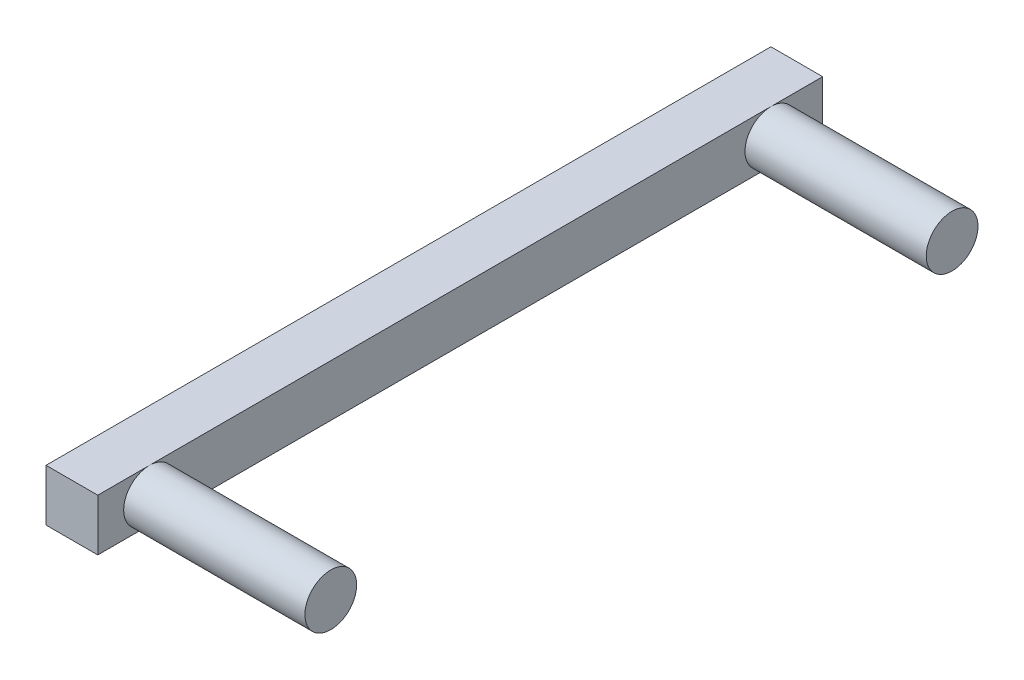
ISO-10303-21;
HEADER;
FILE_DESCRIPTION(('STEP AP214'),'2;1');
FILE_NAME('part.step','',(''),(''),'','','');
FILE_SCHEMA(('AUTOMOTIVE_DESIGN { 1 0 10303 214 1 1 1 1 }'));
ENDSEC;
DATA;
#1=APPLICATION_CONTEXT('core data for automotive mechanical design processes');
#2=APPLICATION_PROTOCOL_DEFINITION('international standard','automotive_design',2000,#1);
#3=PRODUCT_CONTEXT('',#1,'mechanical');
#4=PRODUCT('Part','Part','',(#3));
#5=PRODUCT_RELATED_PRODUCT_CATEGORY('part','',(#4));
#6=PRODUCT_DEFINITION_FORMATION('','',#4);
#7=PRODUCT_DEFINITION_CONTEXT('part definition',#1,'design');
#8=PRODUCT_DEFINITION('design','',#6,#7);
#9=PRODUCT_DEFINITION_SHAPE('','',#8);
#10=(LENGTH_UNIT() NAMED_UNIT(*) SI_UNIT(.MILLI.,.METRE.));
#11=(NAMED_UNIT(*) PLANE_ANGLE_UNIT() SI_UNIT($,.RADIAN.));
#12=(NAMED_UNIT(*) SI_UNIT($,.STERADIAN.) SOLID_ANGLE_UNIT());
#13=UNCERTAINTY_MEASURE_WITH_UNIT(LENGTH_MEASURE(1.E-05),#10,'distance_accuracy_value','');
#14=(GEOMETRIC_REPRESENTATION_CONTEXT(3) GLOBAL_UNCERTAINTY_ASSIGNED_CONTEXT((#13)) GLOBAL_UNIT_ASSIGNED_CONTEXT((#10,
#11,#12)) REPRESENTATION_CONTEXT('',''));
#15=CARTESIAN_POINT('',(0.,0.,0.));
#16=DIRECTION('',(0.,0.,1.));
#17=DIRECTION('',(1.,0.,0.));
#18=AXIS2_PLACEMENT_3D('',#15,#16,#17);
#19=CARTESIAN_POINT('',(10.,0.,0.));
#20=DIRECTION('',(-1.,0.,0.));
#21=DIRECTION('',(0.,0.,1.));
#22=AXIS2_PLACEMENT_3D('',#19,#20,#21);
#23=PLANE('',#22);
#24=CARTESIAN_POINT('',(10.,5.,-130.));
#25=DIRECTION('',(-1.,0.,0.));
#26=DIRECTION('',(0.,0.,1.));
#27=AXIS2_PLACEMENT_3D('',#24,#25,#26);
#28=CIRCLE('',#27,4.99999999999999);
#29=CARTESIAN_POINT('',(10.,0.,-130.));
#30=VERTEX_POINT('',#29);
#31=CARTESIAN_POINT('',(10.,10.,-130.));
#32=VERTEX_POINT('',#31);
#33=EDGE_CURVE('E11',#30,#32,#28,.F.);
#34=ORIENTED_EDGE('',*,*,#33,.F.);
#35=DIRECTION('',(0.,0.,-1.));
#36=VECTOR('',#35,1.);
#37=CARTESIAN_POINT('',(10.,0.,0.));
#38=LINE('',#37,#36);
#39=CARTESIAN_POINT('',(10.,0.,-140.));
#40=VERTEX_POINT('',#39);
#41=EDGE_CURVE('E89',#30,#40,#38,.T.);
#42=ORIENTED_EDGE('',*,*,#41,.T.);
#43=DIRECTION('',(0.,1.,0.));
#44=VECTOR('',#43,1.);
#45=CARTESIAN_POINT('',(10.,0.,-140.));
#46=LINE('',#45,#44);
#47=CARTESIAN_POINT('',(10.,10.,-140.));
#48=VERTEX_POINT('',#47);
#49=EDGE_CURVE('E119',#40,#48,#46,.T.);
#50=ORIENTED_EDGE('',*,*,#49,.T.);
#51=DIRECTION('',(0.,0.,1.));
#52=VECTOR('',#51,1.);
#53=CARTESIAN_POINT('',(10.,10.,0.));
#54=LINE('',#53,#52);
#55=EDGE_CURVE('E101',#48,#32,#54,.T.);
#56=ORIENTED_EDGE('',*,*,#55,.T.);
#57=EDGE_LOOP('',(#34,#42,#50,#56));
#58=FACE_BOUND('',#57,.T.);
#59=ADVANCED_FACE('F35',(#58),#23,.F.);
#60=CARTESIAN_POINT('',(10.,5.,-10.));
#61=DIRECTION('',(1.,0.,0.));
#62=DIRECTION('',(0.,0.,-1.));
#63=AXIS2_PLACEMENT_3D('',#60,#61,#62);
#64=CIRCLE('',#63,5.);
#65=CARTESIAN_POINT('',(10.,10.,-10.));
#66=VERTEX_POINT('',#65);
#67=CARTESIAN_POINT('',(10.,0.,-10.));
#68=VERTEX_POINT('',#67);
#69=EDGE_CURVE('E107',#66,#68,#64,.T.);
#70=ORIENTED_EDGE('',*,*,#69,.F.);
#71=CARTESIAN_POINT('',(10.,10.,0.));
#72=VERTEX_POINT('',#71);
#73=EDGE_CURVE('E121',#66,#72,#54,.T.);
#74=ORIENTED_EDGE('',*,*,#73,.T.);
#75=DIRECTION('',(0.,-1.,0.));
#76=VECTOR('',#75,1.);
#77=CARTESIAN_POINT('',(10.,0.,0.));
#78=LINE('',#77,#76);
#79=CARTESIAN_POINT('',(10.,0.,0.));
#80=VERTEX_POINT('',#79);
#81=EDGE_CURVE('E98',#72,#80,#78,.T.);
#82=ORIENTED_EDGE('',*,*,#81,.T.);
#83=EDGE_CURVE('E88',#80,#68,#38,.T.);
#84=ORIENTED_EDGE('',*,*,#83,.T.);
#85=EDGE_LOOP('',(#70,#74,#82,#84));
#86=FACE_BOUND('',#85,.T.);
#87=ADVANCED_FACE('F144',(#86),#23,.F.);
#88=CARTESIAN_POINT('',(10.,0.,0.));
#89=DIRECTION('',(0.,0.,-1.));
#90=DIRECTION('',(-1.,0.,0.));
#91=AXIS2_PLACEMENT_3D('',#88,#89,#90);
#92=PLANE('',#91);
#93=DIRECTION('',(0.,-1.,0.));
#94=VECTOR('',#93,1.);
#95=CARTESIAN_POINT('',(0.,0.,0.));
#96=LINE('',#95,#94);
#97=CARTESIAN_POINT('',(0.,10.,0.));
#98=VERTEX_POINT('',#97);
#99=CARTESIAN_POINT('',(0.,0.,0.));
#100=VERTEX_POINT('',#99);
#101=EDGE_CURVE('E113',#98,#100,#96,.T.);
#102=ORIENTED_EDGE('',*,*,#101,.T.);
#103=DIRECTION('',(-1.,0.,0.));
#104=VECTOR('',#103,1.);
#105=CARTESIAN_POINT('',(10.,0.,0.));
#106=LINE('',#105,#104);
#107=EDGE_CURVE('E137',#80,#100,#106,.T.);
#108=ORIENTED_EDGE('',*,*,#107,.F.);
#109=ORIENTED_EDGE('',*,*,#81,.F.);
#110=DIRECTION('',(-1.,0.,0.));
#111=VECTOR('',#110,1.);
#112=CARTESIAN_POINT('',(10.,10.,0.));
#113=LINE('',#112,#111);
#114=EDGE_CURVE('E123',#72,#98,#113,.T.);
#115=ORIENTED_EDGE('',*,*,#114,.T.);
#116=EDGE_LOOP('',(#102,#108,#109,#115));
#117=FACE_BOUND('',#116,.T.);
#118=ADVANCED_FACE('F37',(#117),#92,.F.);
#119=CARTESIAN_POINT('',(10.,0.,0.));
#120=DIRECTION('',(0.,1.,0.));
#121=DIRECTION('',(0.,0.,1.));
#122=AXIS2_PLACEMENT_3D('',#119,#120,#121);
#123=PLANE('',#122);
#124=DIRECTION('',(0.,0.,-1.));
#125=VECTOR('',#124,1.);
#126=CARTESIAN_POINT('',(0.,0.,0.));
#127=LINE('',#126,#125);
#128=CARTESIAN_POINT('',(0.,0.,-140.));
#129=VERTEX_POINT('',#128);
#130=EDGE_CURVE('E127',#100,#129,#127,.T.);
#131=ORIENTED_EDGE('',*,*,#130,.T.);
#132=DIRECTION('',(-1.,0.,0.));
#133=VECTOR('',#132,1.);
#134=CARTESIAN_POINT('',(10.,0.,-140.));
#135=LINE('',#134,#133);
#136=EDGE_CURVE('E95',#40,#129,#135,.T.);
#137=ORIENTED_EDGE('',*,*,#136,.F.);
#138=ORIENTED_EDGE('',*,*,#41,.F.);
#139=EDGE_CURVE('E83',#68,#30,#38,.T.);
#140=ORIENTED_EDGE('',*,*,#139,.F.);
#141=ORIENTED_EDGE('',*,*,#83,.F.);
#142=ORIENTED_EDGE('',*,*,#107,.T.);
#143=EDGE_LOOP('',(#131,#137,#138,#140,#141,#142));
#144=FACE_BOUND('',#143,.T.);
#145=ADVANCED_FACE('F93',(#144),#123,.F.);
#146=CARTESIAN_POINT('',(10.,0.,-140.));
#147=DIRECTION('',(0.,0.,1.));
#148=DIRECTION('',(1.,0.,0.));
#149=AXIS2_PLACEMENT_3D('',#146,#147,#148);
#150=PLANE('',#149);
#151=DIRECTION('',(0.,1.,0.));
#152=VECTOR('',#151,1.);
#153=CARTESIAN_POINT('',(0.,0.,-140.));
#154=LINE('',#153,#152);
#155=CARTESIAN_POINT('',(0.,10.,-140.));
#156=VERTEX_POINT('',#155);
#157=EDGE_CURVE('E129',#129,#156,#154,.T.);
#158=ORIENTED_EDGE('',*,*,#157,.T.);
#159=DIRECTION('',(-1.,0.,0.));
#160=VECTOR('',#159,1.);
#161=CARTESIAN_POINT('',(10.,10.,-140.));
#162=LINE('',#161,#160);
#163=EDGE_CURVE('E134',#48,#156,#162,.T.);
#164=ORIENTED_EDGE('',*,*,#163,.F.);
#165=ORIENTED_EDGE('',*,*,#49,.F.);
#166=ORIENTED_EDGE('',*,*,#136,.T.);
#167=EDGE_LOOP('',(#158,#164,#165,#166));
#168=FACE_BOUND('',#167,.T.);
#169=ADVANCED_FACE('F155',(#168),#150,.F.);
#170=CARTESIAN_POINT('',(10.,10.,0.));
#171=DIRECTION('',(0.,-1.,0.));
#172=DIRECTION('',(0.,0.,-1.));
#173=AXIS2_PLACEMENT_3D('',#170,#171,#172);
#174=PLANE('',#173);
#175=DIRECTION('',(0.,0.,1.));
#176=VECTOR('',#175,1.);
#177=CARTESIAN_POINT('',(0.,10.,0.));
#178=LINE('',#177,#176);
#179=EDGE_CURVE('E117',#156,#98,#178,.T.);
#180=ORIENTED_EDGE('',*,*,#179,.T.);
#181=ORIENTED_EDGE('',*,*,#114,.F.);
#182=ORIENTED_EDGE('',*,*,#73,.F.);
#183=EDGE_CURVE('E124',#32,#66,#54,.T.);
#184=ORIENTED_EDGE('',*,*,#183,.F.);
#185=ORIENTED_EDGE('',*,*,#55,.F.);
#186=ORIENTED_EDGE('',*,*,#163,.T.);
#187=EDGE_LOOP('',(#180,#181,#182,#184,#185,#186));
#188=FACE_BOUND('',#187,.T.);
#189=ADVANCED_FACE('F158',(#188),#174,.F.);
#190=CARTESIAN_POINT('',(10.,5.,-130.));
#191=DIRECTION('',(1.,0.,0.));
#192=DIRECTION('',(0.,0.,-1.));
#193=AXIS2_PLACEMENT_3D('',#190,#191,#192);
#194=CIRCLE('',#193,4.99999999999999);
#195=EDGE_CURVE('E50',#32,#30,#194,.T.);
#196=ORIENTED_EDGE('',*,*,#195,.F.);
#197=ORIENTED_EDGE('',*,*,#183,.T.);
#198=EDGE_CURVE('E43',#68,#66,#64,.T.);
#199=ORIENTED_EDGE('',*,*,#198,.F.);
#200=ORIENTED_EDGE('',*,*,#139,.T.);
#201=EDGE_LOOP('',(#196,#197,#199,#200));
#202=FACE_BOUND('',#201,.T.);
#203=ADVANCED_FACE('F85',(#202),#23,.F.);
#204=CARTESIAN_POINT('',(0.,0.,0.));
#205=DIRECTION('',(-1.,0.,0.));
#206=DIRECTION('',(0.,0.,1.));
#207=AXIS2_PLACEMENT_3D('',#204,#205,#206);
#208=PLANE('',#207);
#209=ORIENTED_EDGE('',*,*,#101,.F.);
#210=ORIENTED_EDGE('',*,*,#179,.F.);
#211=ORIENTED_EDGE('',*,*,#157,.F.);
#212=ORIENTED_EDGE('',*,*,#130,.F.);
#213=EDGE_LOOP('',(#209,#210,#211,#212));
#214=FACE_BOUND('',#213,.T.);
#215=ADVANCED_FACE('F152',(#214),#208,.T.);
#216=CARTESIAN_POINT('',(45.,5.,-10.));
#217=DIRECTION('',(-1.,0.,0.));
#218=DIRECTION('',(0.,0.,1.));
#219=AXIS2_PLACEMENT_3D('',#216,#217,#218);
#220=CYLINDRICAL_SURFACE('',#219,5.);
#221=CARTESIAN_POINT('',(45.,5.,-10.));
#222=DIRECTION('',(1.,0.,0.));
#223=DIRECTION('',(0.,0.,-1.));
#224=AXIS2_PLACEMENT_3D('',#221,#222,#223);
#225=CIRCLE('',#224,5.);
#226=CARTESIAN_POINT('',(45.,5.,-15.));
#227=VERTEX_POINT('',#226);
#228=EDGE_CURVE('E110',#227,#227,#225,.T.);
#229=ORIENTED_EDGE('',*,*,#228,.F.);
#230=EDGE_LOOP('',(#229));
#231=FACE_BOUND('',#230,.T.);
#232=ORIENTED_EDGE('',*,*,#69,.T.);
#233=ORIENTED_EDGE('',*,*,#198,.T.);
#234=EDGE_LOOP('',(#232,#233));
#235=FACE_BOUND('',#234,.T.);
#236=ADVANCED_FACE('F141',(#231,#235),#220,.T.);
#237=CARTESIAN_POINT('',(45.,5.,-10.));
#238=DIRECTION('',(1.,0.,0.));
#239=DIRECTION('',(0.,0.,-1.));
#240=AXIS2_PLACEMENT_3D('',#237,#238,#239);
#241=PLANE('',#240);
#242=ORIENTED_EDGE('',*,*,#228,.T.);
#243=EDGE_LOOP('',(#242));
#244=FACE_BOUND('',#243,.T.);
#245=ADVANCED_FACE('F178',(#244),#241,.T.);
#246=CARTESIAN_POINT('',(45.,5.,-130.));
#247=DIRECTION('',(-1.,0.,0.));
#248=DIRECTION('',(0.,0.,1.));
#249=AXIS2_PLACEMENT_3D('',#246,#247,#248);
#250=CYLINDRICAL_SURFACE('',#249,4.99999999999999);
#251=CARTESIAN_POINT('',(45.,5.,-130.));
#252=DIRECTION('',(1.,0.,0.));
#253=DIRECTION('',(0.,0.,-1.));
#254=AXIS2_PLACEMENT_3D('',#251,#252,#253);
#255=CIRCLE('',#254,4.99999999999999);
#256=CARTESIAN_POINT('',(45.,5.,-135.));
#257=VERTEX_POINT('',#256);
#258=EDGE_CURVE('E104',#257,#257,#255,.T.);
#259=ORIENTED_EDGE('',*,*,#258,.F.);
#260=EDGE_LOOP('',(#259));
#261=FACE_BOUND('',#260,.T.);
#262=ORIENTED_EDGE('',*,*,#195,.T.);
#263=ORIENTED_EDGE('',*,*,#33,.T.);
#264=EDGE_LOOP('',(#262,#263));
#265=FACE_BOUND('',#264,.T.);
#266=ADVANCED_FACE('F103',(#261,#265),#250,.T.);
#267=CARTESIAN_POINT('',(45.,5.,-130.));
#268=DIRECTION('',(1.,0.,0.));
#269=DIRECTION('',(0.,0.,-1.));
#270=AXIS2_PLACEMENT_3D('',#267,#268,#269);
#271=PLANE('',#270);
#272=ORIENTED_EDGE('',*,*,#258,.T.);
#273=EDGE_LOOP('',(#272));
#274=FACE_BOUND('',#273,.T.);
#275=ADVANCED_FACE('F188',(#274),#271,.T.);
#276=CLOSED_SHELL('',(#59,#87,#118,#145,#169,#189,#203,#215,#236,#245,#266,#275));
#277=MANIFOLD_SOLID_BREP('B2',#276);
#278=ADVANCED_BREP_SHAPE_REPRESENTATION('',(#18,#277),#14);
#279=SHAPE_DEFINITION_REPRESENTATION(#9,#278);
ENDSEC;
END-ISO-10303-21;
